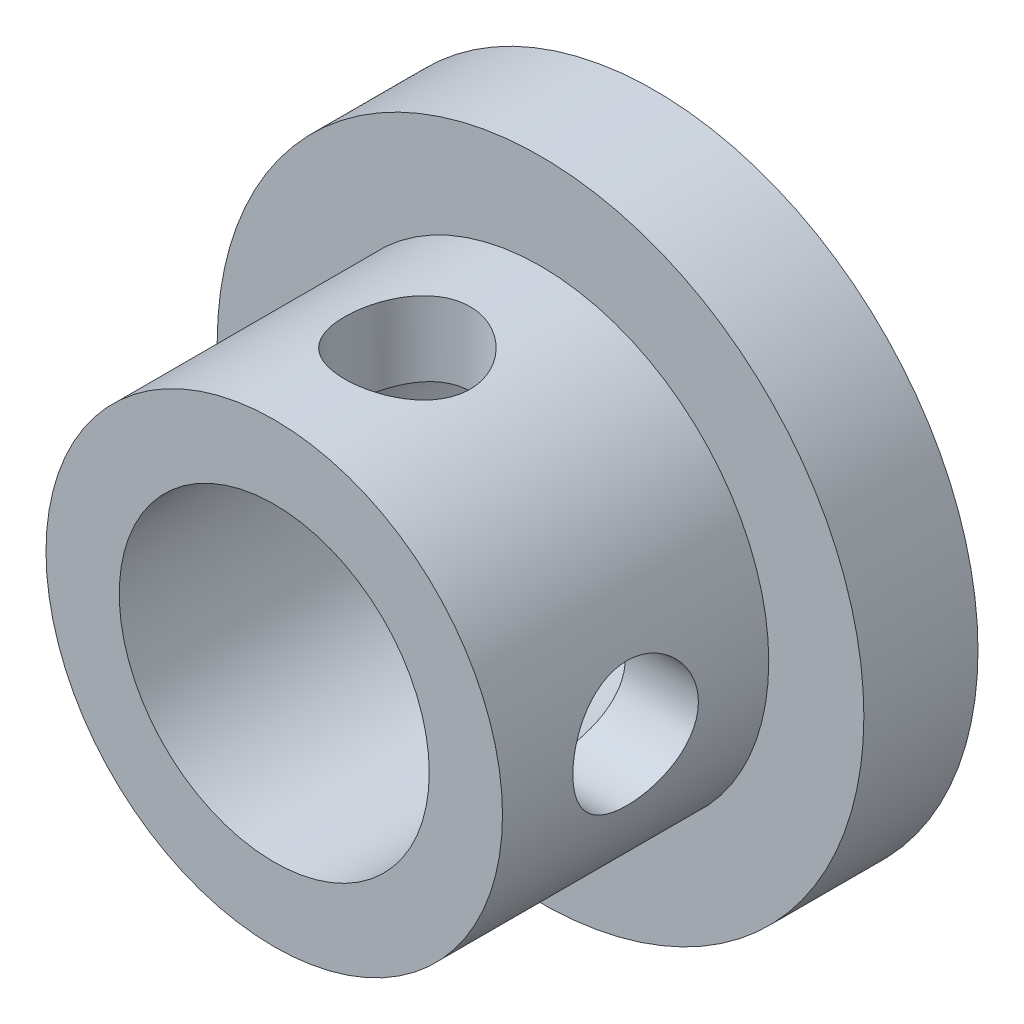
ISO-10303-21;
HEADER;
FILE_DESCRIPTION(('STEP AP214'),'2;1');
FILE_NAME('part.step','',(''),(''),'','','');
FILE_SCHEMA(('AUTOMOTIVE_DESIGN { 1 0 10303 214 1 1 1 1 }'));
ENDSEC;
DATA;
#1=APPLICATION_CONTEXT('core data for automotive mechanical design processes');
#2=APPLICATION_PROTOCOL_DEFINITION('international standard','automotive_design',2000,#1);
#3=PRODUCT_CONTEXT('',#1,'mechanical');
#4=PRODUCT('Part','Part','',(#3));
#5=PRODUCT_RELATED_PRODUCT_CATEGORY('part','',(#4));
#6=PRODUCT_DEFINITION_FORMATION('','',#4);
#7=PRODUCT_DEFINITION_CONTEXT('part definition',#1,'design');
#8=PRODUCT_DEFINITION('design','',#6,#7);
#9=PRODUCT_DEFINITION_SHAPE('','',#8);
#10=(LENGTH_UNIT() NAMED_UNIT(*) SI_UNIT(.MILLI.,.METRE.));
#11=(NAMED_UNIT(*) PLANE_ANGLE_UNIT() SI_UNIT($,.RADIAN.));
#12=(NAMED_UNIT(*) SI_UNIT($,.STERADIAN.) SOLID_ANGLE_UNIT());
#13=UNCERTAINTY_MEASURE_WITH_UNIT(LENGTH_MEASURE(1.E-05),#10,'distance_accuracy_value','');
#14=(GEOMETRIC_REPRESENTATION_CONTEXT(3) GLOBAL_UNCERTAINTY_ASSIGNED_CONTEXT((#13)) GLOBAL_UNIT_ASSIGNED_CONTEXT((#10,
#11,#12)) REPRESENTATION_CONTEXT('',''));
#15=CARTESIAN_POINT('',(0.,0.,0.));
#16=DIRECTION('',(0.,0.,1.));
#17=DIRECTION('',(1.,0.,0.));
#18=AXIS2_PLACEMENT_3D('',#15,#16,#17);
#19=CARTESIAN_POINT('',(0.,0.,3.));
#20=DIRECTION('',(0.,0.,-1.));
#21=DIRECTION('',(-1.,0.,0.));
#22=AXIS2_PLACEMENT_3D('',#19,#20,#21);
#23=CYLINDRICAL_SURFACE('',#22,8.5);
#24=CARTESIAN_POINT('',(0.,0.,3.));
#25=DIRECTION('',(0.,0.,1.));
#26=DIRECTION('',(1.,0.,0.));
#27=AXIS2_PLACEMENT_3D('',#24,#25,#26);
#28=CIRCLE('',#27,8.5);
#29=CARTESIAN_POINT('',(8.5,0.,3.));
#30=VERTEX_POINT('',#29);
#31=EDGE_CURVE('E43',#30,#30,#28,.T.);
#32=ORIENTED_EDGE('',*,*,#31,.F.);
#33=EDGE_LOOP('',(#32));
#34=FACE_BOUND('',#33,.T.);
#35=CARTESIAN_POINT('',(0.,0.,0.));
#36=DIRECTION('',(0.,0.,1.));
#37=DIRECTION('',(1.,0.,0.));
#38=AXIS2_PLACEMENT_3D('',#35,#36,#37);
#39=CIRCLE('',#38,8.5);
#40=CARTESIAN_POINT('',(8.5,0.,0.));
#41=VERTEX_POINT('',#40);
#42=EDGE_CURVE('E39',#41,#41,#39,.T.);
#43=ORIENTED_EDGE('',*,*,#42,.T.);
#44=EDGE_LOOP('',(#43));
#45=FACE_BOUND('',#44,.T.);
#46=ADVANCED_FACE('F36',(#34,#45),#23,.T.);
#47=CARTESIAN_POINT('',(0.,0.,3.));
#48=DIRECTION('',(0.,0.,1.));
#49=DIRECTION('',(1.,0.,0.));
#50=AXIS2_PLACEMENT_3D('',#47,#48,#49);
#51=PLANE('',#50);
#52=CARTESIAN_POINT('',(0.,0.,3.));
#53=DIRECTION('',(0.,0.,1.));
#54=DIRECTION('',(1.,0.,0.));
#55=AXIS2_PLACEMENT_3D('',#52,#53,#54);
#56=CIRCLE('',#55,6.);
#57=CARTESIAN_POINT('',(6.,0.,3.));
#58=VERTEX_POINT('',#57);
#59=EDGE_CURVE('E10',#58,#58,#56,.T.);
#60=ORIENTED_EDGE('',*,*,#59,.F.);
#61=EDGE_LOOP('',(#60));
#62=FACE_BOUND('',#61,.T.);
#63=ORIENTED_EDGE('',*,*,#31,.T.);
#64=EDGE_LOOP('',(#63));
#65=FACE_BOUND('',#64,.T.);
#66=ADVANCED_FACE('F101',(#62,#65),#51,.T.);
#67=CARTESIAN_POINT('',(0.,0.,0.));
#68=DIRECTION('',(0.,0.,1.));
#69=DIRECTION('',(1.,0.,0.));
#70=AXIS2_PLACEMENT_3D('',#67,#68,#69);
#71=PLANE('',#70);
#72=CARTESIAN_POINT('',(0.,0.,0.));
#73=DIRECTION('',(0.,0.,1.));
#74=DIRECTION('',(1.,0.,0.));
#75=AXIS2_PLACEMENT_3D('',#72,#73,#74);
#76=CIRCLE('',#75,4.075);
#77=CARTESIAN_POINT('',(4.075,0.,0.));
#78=VERTEX_POINT('',#77);
#79=EDGE_CURVE('E52',#78,#78,#76,.T.);
#80=ORIENTED_EDGE('',*,*,#79,.T.);
#81=EDGE_LOOP('',(#80));
#82=FACE_BOUND('',#81,.T.);
#83=ORIENTED_EDGE('',*,*,#42,.F.);
#84=EDGE_LOOP('',(#83));
#85=FACE_BOUND('',#84,.T.);
#86=ADVANCED_FACE('F96',(#82,#85),#71,.F.);
#87=CARTESIAN_POINT('',(0.,0.,10.));
#88=DIRECTION('',(0.,0.,-1.));
#89=DIRECTION('',(-1.,0.,0.));
#90=AXIS2_PLACEMENT_3D('',#87,#88,#89);
#91=CYLINDRICAL_SURFACE('',#90,6.);
#92=CARTESIAN_POINT('',(0.,6.,8.14999999999999));
#93=CARTESIAN_POINT('',(-0.0908537283276955,5.99999874308259,8.14999807099644));
#94=CARTESIAN_POINT('',(-0.181727733575567,5.99791622790463,8.14247089912751));
#95=CARTESIAN_POINT('',(-0.3608510125564,5.98981117624032,8.11261870180666));
#96=CARTESIAN_POINT('',(-0.449099121993645,5.98378691845858,8.09028721149158));
#97=CARTESIAN_POINT('',(-0.620359675500258,5.96846215356675,8.03161251353509));
#98=CARTESIAN_POINT('',(-0.703378936424503,5.95916602079348,7.99528800777301));
#99=CARTESIAN_POINT('',(-0.862147532275069,5.9382760100701,7.90972952683832));
#100=CARTESIAN_POINT('',(-0.937896261329998,5.92668194087359,7.86049447707183));
#101=CARTESIAN_POINT('',(-1.08183136781088,5.90212624569014,7.74923811997339));
#102=CARTESIAN_POINT('',(-1.14981405351216,5.88914009329631,7.68695870420413));
#103=CARTESIAN_POINT('',(-1.27451362220699,5.86341857808967,7.55193283429949));
#104=CARTESIAN_POINT('',(-1.33122895521962,5.85068324999801,7.47918494245001));
#105=CARTESIAN_POINT('',(-1.43279568288041,5.82665244921014,7.32363800281994));
#106=CARTESIAN_POINT('',(-1.47740934109682,5.81538781414375,7.24067851730474));
#107=CARTESIAN_POINT('',(-1.55197373568298,5.79593589094513,7.06807591951322));
#108=CARTESIAN_POINT('',(-1.58192736761612,5.78774799518746,6.9784341311204));
#109=CARTESIAN_POINT('',(-1.62560750003858,5.77563040938221,6.79727533624055));
#110=CARTESIAN_POINT('',(-1.63970484886951,5.7716035913248,6.70585440576673));
#111=CARTESIAN_POINT('',(-1.65242890666581,5.76797418839314,6.52186326388272));
#112=CARTESIAN_POINT('',(-1.65105870633263,5.76837071965198,6.42929328576605));
#113=CARTESIAN_POINT('',(-1.63318021863208,5.77345648215431,6.24855455128155));
#114=CARTESIAN_POINT('',(-1.61712435820282,5.77801741181753,6.16033685132934));
#115=CARTESIAN_POINT('',(-1.57105645702899,5.79071212543296,5.9878984571429));
#116=CARTESIAN_POINT('',(-1.54104323793963,5.79884621104433,5.90367810104466));
#117=CARTESIAN_POINT('',(-1.46755257403608,5.8178810068791,5.74046335350015));
#118=CARTESIAN_POINT('',(-1.4239194027705,5.82881343808644,5.66154293706776));
#119=CARTESIAN_POINT('',(-1.32453594216561,5.8521965018176,5.51198691032996));
#120=CARTESIAN_POINT('',(-1.26878313205863,5.86464744994143,5.44135302825628));
#121=CARTESIAN_POINT('',(-1.14444557863618,5.89019543667637,5.30779451200269));
#122=CARTESIAN_POINT('',(-1.07548193780207,5.90329988395933,5.24522350991207));
#123=CARTESIAN_POINT('',(-0.927879174135833,5.92829105959038,5.13245990828775));
#124=CARTESIAN_POINT('',(-0.849239620758372,5.94017773370855,5.08226785987435));
#125=CARTESIAN_POINT('',(-0.683947027422494,5.9614750412231,4.99551741834778));
#126=CARTESIAN_POINT('',(-0.597256901414117,5.97087336103955,4.95902646630247));
#127=CARTESIAN_POINT('',(-0.418654132043704,5.98604617450553,4.9012403007041));
#128=CARTESIAN_POINT('',(-0.326742710235056,5.9918215119967,4.87994154852352));
#129=CARTESIAN_POINT('',(-0.143321506269139,5.99896860669685,4.85370760850691));
#130=CARTESIAN_POINT('',(-0.0518853661978229,6.00046960488126,4.84829201366681));
#131=CARTESIAN_POINT('',(0.130589884597508,5.99927229231555,4.85264666541254));
#132=CARTESIAN_POINT('',(0.221629038058998,5.9965744453723,4.86241523474668));
#133=CARTESIAN_POINT('',(0.398987770207995,5.98736635921293,4.89646806148249));
#134=CARTESIAN_POINT('',(0.485363423879028,5.98092734475059,4.92048130178516));
#135=CARTESIAN_POINT('',(0.652849667611908,5.96497031766695,4.98202439492075));
#136=CARTESIAN_POINT('',(0.733959668311749,5.95545196109898,5.01955575771149));
#137=CARTESIAN_POINT('',(0.890455295917679,5.93409297712807,5.10794021664958));
#138=CARTESIAN_POINT('',(0.965689503643767,5.92220874688329,5.15905061369238));
#139=CARTESIAN_POINT('',(1.10668096711269,5.89749009177705,5.27282154032141));
#140=CARTESIAN_POINT('',(1.17243622308681,5.88465546727348,5.33548450080894));
#141=CARTESIAN_POINT('',(1.29465015721014,5.85900191245662,5.47282845250335));
#142=CARTESIAN_POINT('',(1.35076903800646,5.84619510636324,5.54781465907045));
#143=CARTESIAN_POINT('',(1.44963820489912,5.82246888214059,5.70641351333613));
#144=CARTESIAN_POINT('',(1.49238901579836,5.81154938992678,5.79002582222027));
#145=CARTESIAN_POINT('',(1.56298916810732,5.79296111659894,5.96311233018453));
#146=CARTESIAN_POINT('',(1.59092227269253,5.78527411484172,6.05255029883061));
#147=CARTESIAN_POINT('',(1.63127619202049,5.77402677636451,6.23510353746249));
#148=CARTESIAN_POINT('',(1.64370128166883,5.77046530242998,6.32821778674824));
#149=CARTESIAN_POINT('',(1.65242931750205,5.76797147491959,6.51198988281324));
#150=CARTESIAN_POINT('',(1.64928014369358,5.76888180213839,6.60261995085517));
#151=CARTESIAN_POINT('',(1.62822879843176,5.77485828369776,6.7820034160007));
#152=CARTESIAN_POINT('',(1.61032705344815,5.77992431790445,6.87075686727777));
#153=CARTESIAN_POINT('',(1.56060549557287,5.7935447800639,7.04312897734824));
#154=CARTESIAN_POINT('',(1.52890872620598,5.80206832439478,7.12678574265721));
#155=CARTESIAN_POINT('',(1.45259209961126,5.82164247853969,7.28765860998809));
#156=CARTESIAN_POINT('',(1.40797010013714,5.83269350719869,7.36487364161305));
#157=CARTESIAN_POINT('',(1.30543867870843,5.856507274906,7.51326917305464));
#158=CARTESIAN_POINT('',(1.24715873005677,5.86931260299881,7.58418685503001));
#159=CARTESIAN_POINT('',(1.11966133853961,5.89496224754912,7.71541371112338));
#160=CARTESIAN_POINT('',(1.05044120164629,5.9078065728436,7.77572026449428));
#161=CARTESIAN_POINT('',(0.901092250249271,5.93244341761611,7.88539259257943));
#162=CARTESIAN_POINT('',(0.820747709123236,5.94420464277088,7.93447225610963));
#163=CARTESIAN_POINT('',(0.652625872638594,5.96500063379118,8.01835186671289));
#164=CARTESIAN_POINT('',(0.564853084925041,5.97403703816731,8.05316039996171));
#165=CARTESIAN_POINT('',(0.397919658743001,5.98728597467613,8.10330363251498));
#166=CARTESIAN_POINT('',(0.31943491654889,5.99201791048024,8.1207725479514));
#167=CARTESIAN_POINT('',(0.160638594873061,5.99837530343306,8.14412093024871));
#168=CARTESIAN_POINT('',(0.0803272226686441,6.0000011112883,8.1500017055051));
#169=CARTESIAN_POINT('',(0.,6.,8.14999999999999));
#170=B_SPLINE_CURVE_WITH_KNOTS('',3,(#92,#93,#94,#95,#96,#97,#98,#99,#100,#101,#102,#103,#104,
#105,#106,#107,#108,#109,#110,#111,#112,#113,#114,#115,#116,#117,#118,#119,#120,#121,#122,#123,
#124,#125,#126,#127,#128,#129,#130,#131,#132,#133,#134,#135,#136,#137,#138,#139,#140,#141,#142,
#143,#144,#145,#146,#147,#148,#149,#150,#151,#152,#153,#154,#155,#156,#157,#158,#159,#160,#161,
#162,#163,#164,#165,#166,#167,#168,#169),.UNSPECIFIED.,.T.,.F.,(4,2,2,2,2,2,2,2,2,2,2,2,2,2,2,2,
2,2,2,2,2,2,2,2,2,2,2,2,2,2,2,2,2,2,2,2,2,2,4),(0.,0.272266491235061,0.544651956274201,
0.816674629991572,1.08871995238569,1.36676668474294,1.64485163984642,1.92805811024661,
2.21120862075007,2.48758935156344,2.76391485738986,3.03200413559447,3.30011605124616,
3.57141329094731,3.84276701193227,4.12355975427326,4.40436499546188,4.68653487032462,
4.96863899957846,5.24211776230092,5.5155663185455,5.7839720023726,6.05240767608967,
6.32634577802894,6.60034158820944,6.88259284524951,7.16483302029484,7.44546024030151,
7.7260100861232,7.99676228549103,8.26750665818482,8.53588411360166,8.80430607576222,
9.08108736952952,9.35793692735377,9.64120588287101,9.92430415962327,10.1650524617277,
10.4057735798283),.UNSPECIFIED.);
#171=CARTESIAN_POINT('',(0.,6.,8.14999999999999));
#172=VERTEX_POINT('',#171);
#173=EDGE_CURVE('E164',#172,#172,#170,.T.);
#174=ORIENTED_EDGE('',*,*,#173,.T.);
#175=EDGE_LOOP('',(#174));
#176=FACE_BOUND('',#175,.T.);
#177=CARTESIAN_POINT('',(6.,0.,4.85000000000001));
#178=CARTESIAN_POINT('',(5.99999874308259,-0.0908537283276955,4.85000192900356));
#179=CARTESIAN_POINT('',(5.99791622790463,-0.181727733575567,4.85752910087249));
#180=CARTESIAN_POINT('',(5.98981117624032,-0.3608510125564,4.88738129819334));
#181=CARTESIAN_POINT('',(5.98378691845858,-0.449099121993645,4.90971278850842));
#182=CARTESIAN_POINT('',(5.96846215356675,-0.620359675500258,4.96838748646491));
#183=CARTESIAN_POINT('',(5.95916602079348,-0.703378936424502,5.00471199222699));
#184=CARTESIAN_POINT('',(5.9382760100701,-0.862147532275068,5.09027047316168));
#185=CARTESIAN_POINT('',(5.92668194087359,-0.937896261329998,5.13950552292817));
#186=CARTESIAN_POINT('',(5.90212624569014,-1.08183136781088,5.25076188002661));
#187=CARTESIAN_POINT('',(5.88914009329631,-1.14981405351216,5.31304129579587));
#188=CARTESIAN_POINT('',(5.86341857808967,-1.27451362220699,5.44806716570051));
#189=CARTESIAN_POINT('',(5.85068324999801,-1.33122895521962,5.52081505754999));
#190=CARTESIAN_POINT('',(5.82665244921014,-1.43279568288041,5.67636199718006));
#191=CARTESIAN_POINT('',(5.81538781414375,-1.47740934109682,5.75932148269526));
#192=CARTESIAN_POINT('',(5.79593589094513,-1.55197373568298,5.93192408048678));
#193=CARTESIAN_POINT('',(5.78774799518746,-1.58192736761612,6.0215658688796));
#194=CARTESIAN_POINT('',(5.77563040938221,-1.62560750003858,6.20272466375945));
#195=CARTESIAN_POINT('',(5.7716035913248,-1.63970484886951,6.29414559423327));
#196=CARTESIAN_POINT('',(5.76797418839314,-1.65242890666581,6.47813673611728));
#197=CARTESIAN_POINT('',(5.76837071965198,-1.65105870633263,6.57070671423395));
#198=CARTESIAN_POINT('',(5.77345648215431,-1.63318021863208,6.75144544871845));
#199=CARTESIAN_POINT('',(5.77801741181753,-1.61712435820282,6.83966314867066));
#200=CARTESIAN_POINT('',(5.79071212543296,-1.57105645702899,7.0121015428571));
#201=CARTESIAN_POINT('',(5.79884621104433,-1.54104323793963,7.09632189895534));
#202=CARTESIAN_POINT('',(5.8178810068791,-1.46755257403608,7.25953664649985));
#203=CARTESIAN_POINT('',(5.82881343808644,-1.4239194027705,7.33845706293224));
#204=CARTESIAN_POINT('',(5.8521965018176,-1.32453594216561,7.48801308967004));
#205=CARTESIAN_POINT('',(5.86464744994143,-1.26878313205863,7.55864697174372));
#206=CARTESIAN_POINT('',(5.89019543667637,-1.14444557863618,7.69220548799731));
#207=CARTESIAN_POINT('',(5.90329988395933,-1.07548193780207,7.75477649008794));
#208=CARTESIAN_POINT('',(5.92829105959038,-0.927879174135833,7.86754009171225));
#209=CARTESIAN_POINT('',(5.94017773370855,-0.849239620758372,7.91773214012565));
#210=CARTESIAN_POINT('',(5.9614750412231,-0.683947027422494,8.00448258165222));
#211=CARTESIAN_POINT('',(5.97087336103955,-0.597256901414116,8.04097353369753));
#212=CARTESIAN_POINT('',(5.98604617450553,-0.418654132043704,8.0987596992959));
#213=CARTESIAN_POINT('',(5.9918215119967,-0.326742710235056,8.12005845147648));
#214=CARTESIAN_POINT('',(5.99896860669685,-0.143321506269139,8.14629239149309));
#215=CARTESIAN_POINT('',(6.00046960488126,-0.0518853661978233,8.15170798633319));
#216=CARTESIAN_POINT('',(5.99927229231555,0.130589884597508,8.14735333458746));
#217=CARTESIAN_POINT('',(5.9965744453723,0.221629038058998,8.13758476525332));
#218=CARTESIAN_POINT('',(5.98736635921293,0.398987770207996,8.10353193851751));
#219=CARTESIAN_POINT('',(5.98092734475059,0.485363423879029,8.07951869821484));
#220=CARTESIAN_POINT('',(5.96497031766695,0.652849667611909,8.01797560507925));
#221=CARTESIAN_POINT('',(5.95545196109898,0.73395966831175,7.98044424228852));
#222=CARTESIAN_POINT('',(5.93409297712807,0.89045529591768,7.89205978335042));
#223=CARTESIAN_POINT('',(5.92220874688329,0.965689503643768,7.84094938630762));
#224=CARTESIAN_POINT('',(5.89749009177705,1.10668096711269,7.72717845967859));
#225=CARTESIAN_POINT('',(5.88465546727348,1.17243622308681,7.66451549919106));
#226=CARTESIAN_POINT('',(5.85900191245662,1.29465015721014,7.52717154749665));
#227=CARTESIAN_POINT('',(5.84619510636324,1.35076903800646,7.45218534092955));
#228=CARTESIAN_POINT('',(5.82246888214059,1.44963820489912,7.29358648666387));
#229=CARTESIAN_POINT('',(5.81154938992678,1.49238901579836,7.20997417777973));
#230=CARTESIAN_POINT('',(5.79296111659894,1.56298916810732,7.03688766981547));
#231=CARTESIAN_POINT('',(5.78527411484172,1.59092227269253,6.94744970116939));
#232=CARTESIAN_POINT('',(5.77402677636451,1.63127619202049,6.76489646253751));
#233=CARTESIAN_POINT('',(5.77046530242998,1.64370128166883,6.67178221325177));
#234=CARTESIAN_POINT('',(5.76797147491959,1.65242931750205,6.48801011718676));
#235=CARTESIAN_POINT('',(5.76888180213839,1.64928014369358,6.39738004914483));
#236=CARTESIAN_POINT('',(5.77485828369776,1.62822879843176,6.2179965839993));
#237=CARTESIAN_POINT('',(5.77992431790445,1.61032705344815,6.12924313272223));
#238=CARTESIAN_POINT('',(5.7935447800639,1.56060549557287,5.95687102265176));
#239=CARTESIAN_POINT('',(5.80206832439478,1.52890872620598,5.87321425734279));
#240=CARTESIAN_POINT('',(5.82164247853969,1.45259209961126,5.71234139001191));
#241=CARTESIAN_POINT('',(5.83269350719869,1.40797010013714,5.63512635838695));
#242=CARTESIAN_POINT('',(5.856507274906,1.30543867870843,5.48673082694536));
#243=CARTESIAN_POINT('',(5.86931260299881,1.24715873005676,5.41581314496999));
#244=CARTESIAN_POINT('',(5.89496224754912,1.1196613385396,5.28458628887662));
#245=CARTESIAN_POINT('',(5.9078065728436,1.05044120164629,5.22427973550572));
#246=CARTESIAN_POINT('',(5.93244341761612,0.901092250249271,5.11460740742057));
#247=CARTESIAN_POINT('',(5.94420464277088,0.820747709123236,5.06552774389037));
#248=CARTESIAN_POINT('',(5.96500063379118,0.652625872638595,4.98164813328711));
#249=CARTESIAN_POINT('',(5.97403703816731,0.564853084925042,4.94683960003829));
#250=CARTESIAN_POINT('',(5.98728597467613,0.397919658743001,4.89669636748503));
#251=CARTESIAN_POINT('',(5.99201791048024,0.31943491654889,4.8792274520486));
#252=CARTESIAN_POINT('',(5.99837530343306,0.16063859487306,4.85587906975129));
#253=CARTESIAN_POINT('',(6.0000011112883,0.0803272226686435,4.8499982944949));
#254=CARTESIAN_POINT('',(6.,0.,4.85000000000001));
#255=B_SPLINE_CURVE_WITH_KNOTS('',3,(#177,#178,#179,#180,#181,#182,#183,#184,#185,#186,#187,
#188,#189,#190,#191,#192,#193,#194,#195,#196,#197,#198,#199,#200,#201,#202,#203,#204,#205,#206,
#207,#208,#209,#210,#211,#212,#213,#214,#215,#216,#217,#218,#219,#220,#221,#222,#223,#224,#225,
#226,#227,#228,#229,#230,#231,#232,#233,#234,#235,#236,#237,#238,#239,#240,#241,#242,#243,#244,
#245,#246,#247,#248,#249,#250,#251,#252,#253,#254),.UNSPECIFIED.,.T.,.F.,(4,2,2,2,2,2,2,2,2,2,2,
2,2,2,2,2,2,2,2,2,2,2,2,2,2,2,2,2,2,2,2,2,2,2,2,2,2,2,4),(0.,0.272266491235061,
0.544651956274201,0.816674629991571,1.08871995238569,1.36676668474294,1.64485163984642,
1.92805811024661,2.21120862075007,2.48758935156344,2.76391485738986,3.03200413559447,
3.30011605124616,3.57141329094731,3.84276701193227,4.12355975427326,4.40436499546188,
4.68653487032463,4.96863899957846,5.24211776230092,5.51556631854551,5.7839720023726,
6.05240767608967,6.32634577802895,6.60034158820944,6.88259284524951,7.16483302029484,
7.44546024030151,7.7260100861232,7.99676228549103,8.26750665818483,8.53588411360167,
8.80430607576223,9.08108736952952,9.35793692735377,9.64120588287101,9.92430415962327,
10.1650524617277,10.4057735798283),.UNSPECIFIED.);
#256=CARTESIAN_POINT('',(6.,0.,4.85000000000001));
#257=VERTEX_POINT('',#256);
#258=EDGE_CURVE('E56',#257,#257,#255,.T.);
#259=ORIENTED_EDGE('',*,*,#258,.T.);
#260=EDGE_LOOP('',(#259));
#261=FACE_BOUND('',#260,.T.);
#262=CARTESIAN_POINT('',(0.,0.,10.));
#263=DIRECTION('',(0.,0.,1.));
#264=DIRECTION('',(1.,0.,0.));
#265=AXIS2_PLACEMENT_3D('',#262,#263,#264);
#266=CIRCLE('',#265,6.);
#267=CARTESIAN_POINT('',(6.,0.,10.));
#268=VERTEX_POINT('',#267);
#269=EDGE_CURVE('E49',#268,#268,#266,.T.);
#270=ORIENTED_EDGE('',*,*,#269,.F.);
#271=EDGE_LOOP('',(#270));
#272=FACE_BOUND('',#271,.T.);
#273=ORIENTED_EDGE('',*,*,#59,.T.);
#274=EDGE_LOOP('',(#273));
#275=FACE_BOUND('',#274,.T.);
#276=ADVANCED_FACE('F72',(#176,#261,#272,#275),#91,.T.);
#277=CARTESIAN_POINT('',(0.,0.,10.));
#278=DIRECTION('',(0.,0.,1.));
#279=DIRECTION('',(1.,0.,0.));
#280=AXIS2_PLACEMENT_3D('',#277,#278,#279);
#281=PLANE('',#280);
#282=CARTESIAN_POINT('',(0.,0.,10.));
#283=DIRECTION('',(0.,0.,1.));
#284=DIRECTION('',(1.,0.,0.));
#285=AXIS2_PLACEMENT_3D('',#282,#283,#284);
#286=CIRCLE('',#285,4.075);
#287=CARTESIAN_POINT('',(4.075,0.,10.));
#288=VERTEX_POINT('',#287);
#289=EDGE_CURVE('E53',#288,#288,#286,.T.);
#290=ORIENTED_EDGE('',*,*,#289,.F.);
#291=EDGE_LOOP('',(#290));
#292=FACE_BOUND('',#291,.T.);
#293=ORIENTED_EDGE('',*,*,#269,.T.);
#294=EDGE_LOOP('',(#293));
#295=FACE_BOUND('',#294,.T.);
#296=ADVANCED_FACE('F89',(#292,#295),#281,.T.);
#297=CARTESIAN_POINT('',(0.,0.,0.));
#298=DIRECTION('',(0.,0.,1.));
#299=DIRECTION('',(1.,0.,0.));
#300=AXIS2_PLACEMENT_3D('',#297,#298,#299);
#301=CYLINDRICAL_SURFACE('',#300,4.075);
#302=CARTESIAN_POINT('',(0.,4.075,8.14999999999999));
#303=CARTESIAN_POINT('',(0.0885951020049676,4.07499361335868,8.14999140815714));
#304=CARTESIAN_POINT('',(0.177339915943513,4.07207698872456,8.14282194081303));
#305=CARTESIAN_POINT('',(0.35232404629262,4.06069353023968,8.11439408899893));
#306=CARTESIAN_POINT('',(0.43855597708214,4.05221178062888,8.09309783995219));
#307=CARTESIAN_POINT('',(0.605699839512463,4.03061135747963,8.03732224419837));
#308=CARTESIAN_POINT('',(0.686628341421249,4.01750803207127,8.00288650278891));
#309=CARTESIAN_POINT('',(0.841484812882746,3.98795074187754,7.92198446588551));
#310=CARTESIAN_POINT('',(0.915415110655286,3.97149789721776,7.87552219082454));
#311=CARTESIAN_POINT('',(1.05783636519126,3.93601679940946,7.76952847690864));
#312=CARTESIAN_POINT('',(1.12594725317512,3.91690730765911,7.70951374769151));
#313=CARTESIAN_POINT('',(1.25146045893508,3.87863196675299,7.57913925692216));
#314=CARTESIAN_POINT('',(1.30885742377704,3.85946609425947,7.50877435539803));
#315=CARTESIAN_POINT('',(1.41390812093047,3.82226903326859,7.35578046690847));
#316=CARTESIAN_POINT('',(1.46099437781638,3.804330177733,7.27273706060617));
#317=CARTESIAN_POINT('',(1.5403607047009,3.7728967331635,7.09907476286643));
#318=CARTESIAN_POINT('',(1.57264798057252,3.7593999820987,7.00845958371957));
#319=CARTESIAN_POINT('',(1.61995321637689,3.73925312153815,6.8265958379012));
#320=CARTESIAN_POINT('',(1.63569998471697,3.73231555174715,6.73556987154989));
#321=CARTESIAN_POINT('',(1.65175306049082,3.72524118402565,6.55192358098506));
#322=CARTESIAN_POINT('',(1.65206722171503,3.72510092688303,6.45930409173793));
#323=CARTESIAN_POINT('',(1.63779749088194,3.73139237197486,6.28217633371092));
#324=CARTESIAN_POINT('',(1.62427908308152,3.73735406706432,6.19756225771361));
#325=CARTESIAN_POINT('',(1.58450761809194,3.75438724750519,6.03192628395165));
#326=CARTESIAN_POINT('',(1.5582522774394,3.76545964908119,5.95090503314849));
#327=CARTESIAN_POINT('',(1.49324846823388,3.79171200360068,5.79277239296281));
#328=CARTESIAN_POINT('',(1.45425291076984,3.80697215248248,5.71577648344621));
#329=CARTESIAN_POINT('',(1.3650494158658,3.83985950434488,5.56913331614337));
#330=CARTESIAN_POINT('',(1.31483720323124,3.8574876088406,5.49948887529106));
#331=CARTESIAN_POINT('',(1.19994214569101,3.89482849583446,5.36370730637926));
#332=CARTESIAN_POINT('',(1.13442698649028,3.91459567862855,5.29828750280207));
#333=CARTESIAN_POINT('',(0.993149171681729,3.95280031302955,5.17913054775711));
#334=CARTESIAN_POINT('',(0.917384379045458,3.97123748609962,5.12539583871697));
#335=CARTESIAN_POINT('',(0.75568123410403,4.00518739565571,5.03016134931732));
#336=CARTESIAN_POINT('',(0.669564785344717,4.02063171281086,4.98893779147939));
#337=CARTESIAN_POINT('',(0.490835079614353,4.04633625388815,4.92181113982676));
#338=CARTESIAN_POINT('',(0.398225235503482,4.05659917817722,4.89590006446012));
#339=CARTESIAN_POINT('',(0.215145083138742,4.07028885059766,4.86159932532945));
#340=CARTESIAN_POINT('',(0.124883303022062,4.07409100147167,4.85224605422146));
#341=CARTESIAN_POINT('',(-0.0559918288997646,4.07561782577682,4.84847311995775));
#342=CARTESIAN_POINT('',(-0.146605080318219,4.07334412287527,4.85404946711933));
#343=CARTESIAN_POINT('',(-0.321201340269641,4.06321984081121,4.87927424233167));
#344=CARTESIAN_POINT('',(-0.40529711109703,4.0556322504801,4.89825941767267));
#345=CARTESIAN_POINT('',(-0.569027894578127,4.03591832931223,4.94885447842847));
#346=CARTESIAN_POINT('',(-0.648662335183784,4.02379141795154,4.98046597863125));
#347=CARTESIAN_POINT('',(-0.803968220148946,3.99570797263693,5.05644923299249));
#348=CARTESIAN_POINT('',(-0.879442447699492,3.9796451252841,5.10118354185242));
#349=CARTESIAN_POINT('',(-1.02207982038033,3.94542352244508,5.20174154833021));
#350=CARTESIAN_POINT('',(-1.08923957244431,3.92726391709417,5.25756974921744));
#351=CARTESIAN_POINT('',(-1.21810829894959,3.88929961084311,5.38315490081578));
#352=CARTESIAN_POINT('',(-1.27914163718862,3.86946670100396,5.45359842754235));
#353=CARTESIAN_POINT('',(-1.38869337132714,3.83151741619412,5.60406885956365));
#354=CARTESIAN_POINT('',(-1.43720948871713,3.81340135412038,5.68409750576095));
#355=CARTESIAN_POINT('',(-1.52071662026063,3.78088423365625,5.85279824091775));
#356=CARTESIAN_POINT('',(-1.55555364787256,3.76652604629508,5.94155541274833));
#357=CARTESIAN_POINT('',(-1.60950979450655,3.74379174858661,6.12443525722383));
#358=CARTESIAN_POINT('',(-1.6286409058348,3.73541107473112,6.21855377735862));
#359=CARTESIAN_POINT('',(-1.64948291420145,3.72625129599679,6.40203460351759));
#360=CARTESIAN_POINT('',(-1.6523702198583,3.72495902329039,6.49123842843703));
#361=CARTESIAN_POINT('',(-1.64374689370076,3.728772389476,6.66879898756841));
#362=CARTESIAN_POINT('',(-1.63223819426688,3.73387716968966,6.7571558338665));
#363=CARTESIAN_POINT('',(-1.59611853082718,3.74945193815685,6.92674891118578));
#364=CARTESIAN_POINT('',(-1.57207145348318,3.75969034604078,7.00812847023983));
#365=CARTESIAN_POINT('',(-1.5120919911921,3.78421022631333,7.16572665245954));
#366=CARTESIAN_POINT('',(-1.47615630644044,3.79849282104858,7.24194383567117));
#367=CARTESIAN_POINT('',(-1.39100817034474,3.83052243169371,7.3918834793225));
#368=CARTESIAN_POINT('',(-1.34114533364924,3.84842257948425,7.46520333001276));
#369=CARTESIAN_POINT('',(-1.2304972886183,3.88521525929222,7.60280397808109));
#370=CARTESIAN_POINT('',(-1.16970864107,3.90410810246006,7.66708191786787));
#371=CARTESIAN_POINT('',(-1.03408073305536,3.94228166161234,7.78920533686194));
#372=CARTESIAN_POINT('',(-0.958572201163326,3.96150327828797,7.84632935589519));
#373=CARTESIAN_POINT('',(-0.798316542842891,3.9968785881789,7.94711689133525));
#374=CARTESIAN_POINT('',(-0.713565176126353,4.01303086389058,7.99077419422585));
#375=CARTESIAN_POINT('',(-0.53871986873407,4.04018493130471,8.06238563495403));
#376=CARTESIAN_POINT('',(-0.448750231324164,4.05127456676411,8.09060942420935));
#377=CARTESIAN_POINT('',(-0.264969228560776,4.0674140521613,8.13128517525935));
#378=CARTESIAN_POINT('',(-0.171170987254814,4.07248299315234,8.14378699737805));
#379=CARTESIAN_POINT('',(-0.0514236860654577,4.07475846948828,8.14940155922513));
#380=CARTESIAN_POINT('',(-0.025718150957149,4.07500185396937,8.1500024941143));
#381=CARTESIAN_POINT('',(0.,4.075,8.14999999999999));
#382=B_SPLINE_CURVE_WITH_KNOTS('',3,(#302,#303,#304,#305,#306,#307,#308,#309,#310,#311,#312,
#313,#314,#315,#316,#317,#318,#319,#320,#321,#322,#323,#324,#325,#326,#327,#328,#329,#330,#331,
#332,#333,#334,#335,#336,#337,#338,#339,#340,#341,#342,#343,#344,#345,#346,#347,#348,#349,#350,
#351,#352,#353,#354,#355,#356,#357,#358,#359,#360,#361,#362,#363,#364,#365,#366,#367,#368,#369,
#370,#371,#372,#373,#374,#375,#376,#377,#378,#379,#380,#381),.UNSPECIFIED.,.T.,.F.,(4,2,2,2,2,2,
2,2,2,2,2,2,2,2,2,2,2,2,2,2,2,2,2,2,2,2,2,2,2,2,2,2,2,2,2,2,2,2,2,4),(0.,0.265715261899104,
0.53214562443196,0.797699383206504,1.06316448257501,1.34025683751122,1.61748726606295,
1.90743031739148,2.19723204019775,2.47364733201317,2.7499219521805,3.00640797706377,
3.26294000148347,3.52477619621948,3.78671235983463,4.06944230253569,4.35223128498884,
4.64087272251192,4.929363574178,5.20043274899878,5.47142949249407,5.72988351896262,
5.98837060985488,6.2548077929455,6.52135335084503,6.8059221516271,7.09054271597453,
7.37828123067169,7.66579983676202,7.93219814745048,8.19856070324252,8.45386311512341,
8.70923644833477,8.97945567385648,9.24976010808867,9.53820980290788,9.82679238945563,
10.1101572154387,10.3926210989663,10.4697552188272),.UNSPECIFIED.);
#383=CARTESIAN_POINT('',(0.,4.075,8.14999999999999));
#384=VERTEX_POINT('',#383);
#385=EDGE_CURVE('E160',#384,#384,#382,.T.);
#386=ORIENTED_EDGE('',*,*,#385,.T.);
#387=EDGE_LOOP('',(#386));
#388=FACE_BOUND('',#387,.T.);
#389=CARTESIAN_POINT('',(4.075,0.,4.85000000000001));
#390=CARTESIAN_POINT('',(4.07499361335868,0.0885951020049675,4.85000859184286));
#391=CARTESIAN_POINT('',(4.07207698872456,0.177339915943512,4.85717805918697));
#392=CARTESIAN_POINT('',(4.06069353023968,0.352324046292619,4.88560591100107));
#393=CARTESIAN_POINT('',(4.05221178062888,0.438555977082139,4.90690216004781));
#394=CARTESIAN_POINT('',(4.03061135747963,0.605699839512463,4.96267775580163));
#395=CARTESIAN_POINT('',(4.01750803207127,0.686628341421248,4.99711349721109));
#396=CARTESIAN_POINT('',(3.98795074187754,0.841484812882745,5.07801553411449));
#397=CARTESIAN_POINT('',(3.97149789721776,0.915415110655285,5.12447780917545));
#398=CARTESIAN_POINT('',(3.93601679940946,1.05783636519126,5.23047152309136));
#399=CARTESIAN_POINT('',(3.91690730765911,1.12594725317512,5.29048625230849));
#400=CARTESIAN_POINT('',(3.87863196675299,1.25146045893508,5.42086074307784));
#401=CARTESIAN_POINT('',(3.85946609425947,1.30885742377704,5.49122564460197));
#402=CARTESIAN_POINT('',(3.82226903326859,1.41390812093047,5.64421953309153));
#403=CARTESIAN_POINT('',(3.804330177733,1.46099437781638,5.72726293939383));
#404=CARTESIAN_POINT('',(3.7728967331635,1.5403607047009,5.90092523713357));
#405=CARTESIAN_POINT('',(3.7593999820987,1.57264798057252,5.99154041628043));
#406=CARTESIAN_POINT('',(3.73925312153814,1.61995321637689,6.1734041620988));
#407=CARTESIAN_POINT('',(3.73231555174715,1.63569998471697,6.26443012845011));
#408=CARTESIAN_POINT('',(3.72524118402565,1.65175306049082,6.44807641901494));
#409=CARTESIAN_POINT('',(3.72510092688303,1.65206722171503,6.54069590826207));
#410=CARTESIAN_POINT('',(3.73139237197486,1.63779749088194,6.71782366628908));
#411=CARTESIAN_POINT('',(3.73735406706432,1.62427908308152,6.80243774228639));
#412=CARTESIAN_POINT('',(3.75438724750519,1.58450761809194,6.96807371604835));
#413=CARTESIAN_POINT('',(3.76545964908119,1.5582522774394,7.04909496685151));
#414=CARTESIAN_POINT('',(3.79171200360068,1.49324846823388,7.20722760703719));
#415=CARTESIAN_POINT('',(3.80697215248248,1.45425291076984,7.28422351655379));
#416=CARTESIAN_POINT('',(3.83985950434488,1.3650494158658,7.43086668385663));
#417=CARTESIAN_POINT('',(3.8574876088406,1.31483720323124,7.50051112470894));
#418=CARTESIAN_POINT('',(3.89482849583446,1.19994214569101,7.63629269362074));
#419=CARTESIAN_POINT('',(3.91459567862854,1.13442698649028,7.70171249719793));
#420=CARTESIAN_POINT('',(3.95280031302954,0.99314917168173,7.82086945224289));
#421=CARTESIAN_POINT('',(3.97123748609962,0.917384379045459,7.87460416128303));
#422=CARTESIAN_POINT('',(4.00518739565571,0.755681234104031,7.96983865068268));
#423=CARTESIAN_POINT('',(4.02063171281086,0.669564785344718,8.01106220852061));
#424=CARTESIAN_POINT('',(4.04633625388815,0.490835079614354,8.07818886017324));
#425=CARTESIAN_POINT('',(4.05659917817723,0.398225235503483,8.10409993553988));
#426=CARTESIAN_POINT('',(4.07028885059766,0.215145083138743,8.13840067467056));
#427=CARTESIAN_POINT('',(4.07409100147167,0.124883303022063,8.14775394577854));
#428=CARTESIAN_POINT('',(4.07561782577682,-0.0559918288997642,8.15152688004225));
#429=CARTESIAN_POINT('',(4.07334412287527,-0.146605080318219,8.14595053288067));
#430=CARTESIAN_POINT('',(4.06321984081121,-0.321201340269641,8.12072575766833));
#431=CARTESIAN_POINT('',(4.0556322504801,-0.40529711109703,8.10174058232733));
#432=CARTESIAN_POINT('',(4.03591832931223,-0.569027894578127,8.05114552157153));
#433=CARTESIAN_POINT('',(4.02379141795154,-0.648662335183785,8.01953402136875));
#434=CARTESIAN_POINT('',(3.99570797263693,-0.803968220148945,7.94355076700751));
#435=CARTESIAN_POINT('',(3.9796451252841,-0.879442447699492,7.89881645814758));
#436=CARTESIAN_POINT('',(3.94542352244508,-1.02207982038033,7.7982584516698));
#437=CARTESIAN_POINT('',(3.92726391709417,-1.08923957244431,7.74243025078256));
#438=CARTESIAN_POINT('',(3.88929961084311,-1.21810829894959,7.61684509918422));
#439=CARTESIAN_POINT('',(3.86946670100396,-1.27914163718862,7.54640157245765));
#440=CARTESIAN_POINT('',(3.83151741619412,-1.38869337132714,7.39593114043635));
#441=CARTESIAN_POINT('',(3.81340135412038,-1.43720948871713,7.31590249423905));
#442=CARTESIAN_POINT('',(3.78088423365625,-1.52071662026063,7.14720175908225));
#443=CARTESIAN_POINT('',(3.76652604629508,-1.55555364787256,7.05844458725168));
#444=CARTESIAN_POINT('',(3.74379174858661,-1.60950979450655,6.87556474277617));
#445=CARTESIAN_POINT('',(3.73541107473112,-1.6286409058348,6.78144622264138));
#446=CARTESIAN_POINT('',(3.72625129599679,-1.64948291420145,6.59796539648241));
#447=CARTESIAN_POINT('',(3.72495902329039,-1.6523702198583,6.50876157156297));
#448=CARTESIAN_POINT('',(3.728772389476,-1.64374689370076,6.33120101243159));
#449=CARTESIAN_POINT('',(3.73387716968966,-1.63223819426688,6.2428441661335));
#450=CARTESIAN_POINT('',(3.74945193815685,-1.59611853082718,6.07325108881422));
#451=CARTESIAN_POINT('',(3.75969034604078,-1.57207145348318,5.99187152976017));
#452=CARTESIAN_POINT('',(3.78421022631333,-1.5120919911921,5.83427334754046));
#453=CARTESIAN_POINT('',(3.79849282104858,-1.47615630644044,5.75805616432883));
#454=CARTESIAN_POINT('',(3.83052243169371,-1.39100817034474,5.6081165206775));
#455=CARTESIAN_POINT('',(3.84842257948425,-1.34114533364924,5.53479666998724));
#456=CARTESIAN_POINT('',(3.88521525929222,-1.2304972886183,5.39719602191891));
#457=CARTESIAN_POINT('',(3.90410810246006,-1.16970864107,5.33291808213214));
#458=CARTESIAN_POINT('',(3.94228166161234,-1.03408073305536,5.21079466313806));
#459=CARTESIAN_POINT('',(3.96150327828797,-0.958572201163326,5.15367064410481));
#460=CARTESIAN_POINT('',(3.9968785881789,-0.798316542842891,5.05288310866475));
#461=CARTESIAN_POINT('',(4.01303086389058,-0.713565176126354,5.00922580577415));
#462=CARTESIAN_POINT('',(4.04018493130471,-0.538719868734072,4.93761436504597));
#463=CARTESIAN_POINT('',(4.05127456676411,-0.448750231324165,4.90939057579065));
#464=CARTESIAN_POINT('',(4.0674140521613,-0.264969228560777,4.86871482474065));
#465=CARTESIAN_POINT('',(4.07248299315234,-0.171170987254814,4.85621300262195));
#466=CARTESIAN_POINT('',(4.07475846948828,-0.0514236860654576,4.85059844077487));
#467=CARTESIAN_POINT('',(4.07500185396937,-0.0257181509571489,4.8499975058857));
#468=CARTESIAN_POINT('',(4.075,0.,4.85000000000001));
#469=B_SPLINE_CURVE_WITH_KNOTS('',3,(#389,#390,#391,#392,#393,#394,#395,#396,#397,#398,#399,
#400,#401,#402,#403,#404,#405,#406,#407,#408,#409,#410,#411,#412,#413,#414,#415,#416,#417,#418,
#419,#420,#421,#422,#423,#424,#425,#426,#427,#428,#429,#430,#431,#432,#433,#434,#435,#436,#437,
#438,#439,#440,#441,#442,#443,#444,#445,#446,#447,#448,#449,#450,#451,#452,#453,#454,#455,#456,
#457,#458,#459,#460,#461,#462,#463,#464,#465,#466,#467,#468),.UNSPECIFIED.,.T.,.F.,(4,2,2,2,2,2,
2,2,2,2,2,2,2,2,2,2,2,2,2,2,2,2,2,2,2,2,2,2,2,2,2,2,2,2,2,2,2,2,2,4),(0.,0.265715261899104,
0.53214562443196,0.797699383206502,1.06316448257501,1.34025683751122,1.61748726606294,
1.90743031739148,2.19723204019774,2.47364733201317,2.7499219521805,3.00640797706377,
3.26294000148347,3.52477619621948,3.78671235983463,4.06944230253569,4.35223128498884,
4.64087272251192,4.92936357417801,5.20043274899878,5.47142949249407,5.72988351896263,
5.98837060985488,6.2548077929455,6.52135335084503,6.8059221516271,7.09054271597453,
7.3782812306717,7.66579983676202,7.93219814745048,8.19856070324252,8.45386311512341,
8.70923644833477,8.97945567385648,9.24976010808867,9.53820980290788,9.82679238945563,
10.1101572154387,10.3926210989663,10.4697552188272),.UNSPECIFIED.);
#470=CARTESIAN_POINT('',(4.075,0.,4.85000000000001));
#471=VERTEX_POINT('',#470);
#472=EDGE_CURVE('E66',#471,#471,#469,.T.);
#473=ORIENTED_EDGE('',*,*,#472,.T.);
#474=EDGE_LOOP('',(#473));
#475=FACE_BOUND('',#474,.T.);
#476=ORIENTED_EDGE('',*,*,#79,.F.);
#477=EDGE_LOOP('',(#476));
#478=FACE_BOUND('',#477,.T.);
#479=ORIENTED_EDGE('',*,*,#289,.T.);
#480=EDGE_LOOP('',(#479));
#481=FACE_BOUND('',#480,.T.);
#482=ADVANCED_FACE('F81',(#388,#475,#478,#481),#301,.F.);
#483=CARTESIAN_POINT('',(6.,0.,6.5));
#484=DIRECTION('',(1.,0.,0.));
#485=DIRECTION('',(0.,0.,-1.));
#486=AXIS2_PLACEMENT_3D('',#483,#484,#485);
#487=CYLINDRICAL_SURFACE('',#486,1.64999999999999);
#488=ORIENTED_EDGE('',*,*,#472,.F.);
#489=EDGE_LOOP('',(#488));
#490=FACE_BOUND('',#489,.T.);
#491=ORIENTED_EDGE('',*,*,#258,.F.);
#492=EDGE_LOOP('',(#491));
#493=FACE_BOUND('',#492,.T.);
#494=ADVANCED_FACE('F76',(#490,#493),#487,.F.);
#495=CARTESIAN_POINT('',(0.,6.,6.5));
#496=DIRECTION('',(0.,1.,0.));
#497=DIRECTION('',(0.,0.,1.));
#498=AXIS2_PLACEMENT_3D('',#495,#496,#497);
#499=CYLINDRICAL_SURFACE('',#498,1.64999999999999);
#500=ORIENTED_EDGE('',*,*,#385,.F.);
#501=EDGE_LOOP('',(#500));
#502=FACE_BOUND('',#501,.T.);
#503=ORIENTED_EDGE('',*,*,#173,.F.);
#504=EDGE_LOOP('',(#503));
#505=FACE_BOUND('',#504,.T.);
#506=ADVANCED_FACE('F80',(#502,#505),#499,.F.);
#507=CLOSED_SHELL('',(#46,#66,#86,#276,#296,#482,#494,#506));
#508=MANIFOLD_SOLID_BREP('B2',#507);
#509=ADVANCED_BREP_SHAPE_REPRESENTATION('',(#18,#508),#14);
#510=SHAPE_DEFINITION_REPRESENTATION(#9,#509);
ENDSEC;
END-ISO-10303-21;
